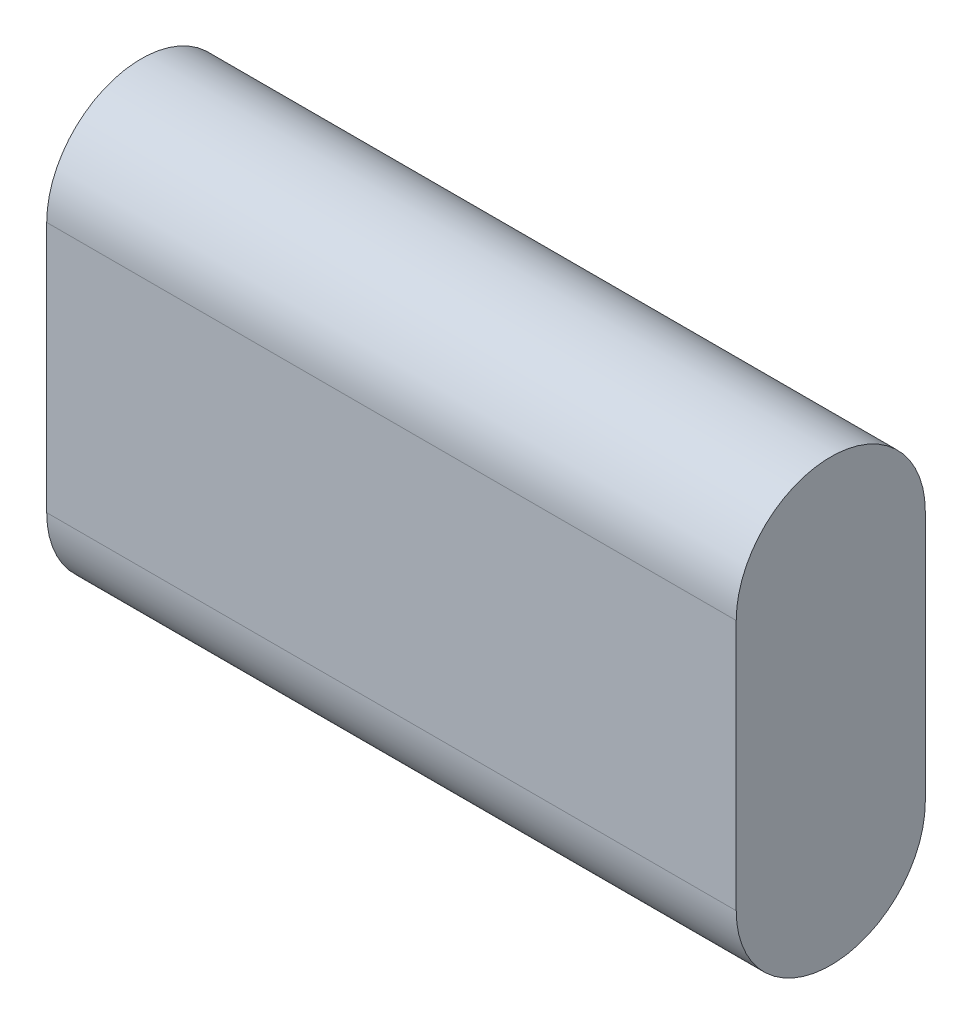
ISO-10303-21;
HEADER;
FILE_DESCRIPTION(('STEP AP214'),'2;1');
FILE_NAME('part.step','',(''),(''),'','','');
FILE_SCHEMA(('AUTOMOTIVE_DESIGN { 1 0 10303 214 1 1 1 1 }'));
ENDSEC;
DATA;
#1=APPLICATION_CONTEXT('core data for automotive mechanical design processes');
#2=APPLICATION_PROTOCOL_DEFINITION('international standard','automotive_design',2000,#1);
#3=PRODUCT_CONTEXT('',#1,'mechanical');
#4=PRODUCT('Part','Part','',(#3));
#5=PRODUCT_RELATED_PRODUCT_CATEGORY('part','',(#4));
#6=PRODUCT_DEFINITION_FORMATION('','',#4);
#7=PRODUCT_DEFINITION_CONTEXT('part definition',#1,'design');
#8=PRODUCT_DEFINITION('design','',#6,#7);
#9=PRODUCT_DEFINITION_SHAPE('','',#8);
#10=(LENGTH_UNIT() NAMED_UNIT(*) SI_UNIT(.MILLI.,.METRE.));
#11=(NAMED_UNIT(*) PLANE_ANGLE_UNIT() SI_UNIT($,.RADIAN.));
#12=(NAMED_UNIT(*) SI_UNIT($,.STERADIAN.) SOLID_ANGLE_UNIT());
#13=UNCERTAINTY_MEASURE_WITH_UNIT(LENGTH_MEASURE(1.E-05),#10,'distance_accuracy_value','');
#14=(GEOMETRIC_REPRESENTATION_CONTEXT(3) GLOBAL_UNCERTAINTY_ASSIGNED_CONTEXT((#13)) GLOBAL_UNIT_ASSIGNED_CONTEXT((#10,
#11,#12)) REPRESENTATION_CONTEXT('',''));
#15=CARTESIAN_POINT('',(0.,0.,0.));
#16=DIRECTION('',(0.,0.,1.));
#17=DIRECTION('',(1.,0.,0.));
#18=AXIS2_PLACEMENT_3D('',#15,#16,#17);
#19=CARTESIAN_POINT('',(15.5,-5.65,0.));
#20=DIRECTION('',(-1.,0.,0.));
#21=DIRECTION('',(0.,0.,1.));
#22=AXIS2_PLACEMENT_3D('',#19,#20,#21);
#23=CYLINDRICAL_SURFACE('',#22,4.25);
#24=CARTESIAN_POINT('',(-15.5,-5.65,0.));
#25=DIRECTION('',(1.,0.,0.));
#26=DIRECTION('',(0.,0.,-1.));
#27=AXIS2_PLACEMENT_3D('',#24,#25,#26);
#28=CIRCLE('',#27,4.25);
#29=CARTESIAN_POINT('',(-15.5,-5.65,4.25));
#30=VERTEX_POINT('',#29);
#31=CARTESIAN_POINT('',(-15.5,-5.65,-4.25));
#32=VERTEX_POINT('',#31);
#33=EDGE_CURVE('E105',#30,#32,#28,.T.);
#34=ORIENTED_EDGE('',*,*,#33,.T.);
#35=DIRECTION('',(-1.,0.,0.));
#36=VECTOR('',#35,1.);
#37=CARTESIAN_POINT('',(15.5,-5.65,-4.25));
#38=LINE('',#37,#36);
#39=CARTESIAN_POINT('',(15.5,-5.65,-4.25));
#40=VERTEX_POINT('',#39);
#41=EDGE_CURVE('E11',#40,#32,#38,.T.);
#42=ORIENTED_EDGE('',*,*,#41,.F.);
#43=CARTESIAN_POINT('',(15.5,-5.65,0.));
#44=DIRECTION('',(1.,0.,0.));
#45=DIRECTION('',(0.,0.,-1.));
#46=AXIS2_PLACEMENT_3D('',#43,#44,#45);
#47=CIRCLE('',#46,4.25);
#48=CARTESIAN_POINT('',(15.5,-5.65,4.25));
#49=VERTEX_POINT('',#48);
#50=EDGE_CURVE('E89',#49,#40,#47,.T.);
#51=ORIENTED_EDGE('',*,*,#50,.F.);
#52=DIRECTION('',(-1.,0.,0.));
#53=VECTOR('',#52,1.);
#54=CARTESIAN_POINT('',(15.5,-5.65,4.25));
#55=LINE('',#54,#53);
#56=EDGE_CURVE('E97',#49,#30,#55,.T.);
#57=ORIENTED_EDGE('',*,*,#56,.T.);
#58=EDGE_LOOP('',(#34,#42,#51,#57));
#59=FACE_BOUND('',#58,.T.);
#60=ADVANCED_FACE('F39',(#59),#23,.T.);
#61=CARTESIAN_POINT('',(15.5,-5.65,-4.25));
#62=DIRECTION('',(0.,0.,1.));
#63=DIRECTION('',(0.,-1.,0.));
#64=AXIS2_PLACEMENT_3D('',#61,#62,#63);
#65=PLANE('',#64);
#66=DIRECTION('',(0.,1.,0.));
#67=VECTOR('',#66,1.);
#68=CARTESIAN_POINT('',(-15.5,-5.65,-4.25));
#69=LINE('',#68,#67);
#70=CARTESIAN_POINT('',(-15.5,5.65,-4.25));
#71=VERTEX_POINT('',#70);
#72=EDGE_CURVE('E92',#32,#71,#69,.T.);
#73=ORIENTED_EDGE('',*,*,#72,.T.);
#74=DIRECTION('',(-1.,0.,0.));
#75=VECTOR('',#74,1.);
#76=CARTESIAN_POINT('',(15.5,5.65,-4.25));
#77=LINE('',#76,#75);
#78=CARTESIAN_POINT('',(15.5,5.65,-4.25));
#79=VERTEX_POINT('',#78);
#80=EDGE_CURVE('E50',#79,#71,#77,.T.);
#81=ORIENTED_EDGE('',*,*,#80,.F.);
#82=DIRECTION('',(0.,1.,0.));
#83=VECTOR('',#82,1.);
#84=CARTESIAN_POINT('',(15.5,-5.65,-4.25));
#85=LINE('',#84,#83);
#86=EDGE_CURVE('E82',#40,#79,#85,.T.);
#87=ORIENTED_EDGE('',*,*,#86,.F.);
#88=ORIENTED_EDGE('',*,*,#41,.T.);
#89=EDGE_LOOP('',(#73,#81,#87,#88));
#90=FACE_BOUND('',#89,.T.);
#91=ADVANCED_FACE('F93',(#90),#65,.F.);
#92=CARTESIAN_POINT('',(15.5,5.65,0.));
#93=DIRECTION('',(-1.,0.,0.));
#94=DIRECTION('',(0.,0.,1.));
#95=AXIS2_PLACEMENT_3D('',#92,#93,#94);
#96=CYLINDRICAL_SURFACE('',#95,4.25);
#97=CARTESIAN_POINT('',(-15.5,5.65,0.));
#98=DIRECTION('',(1.,0.,0.));
#99=DIRECTION('',(0.,0.,-1.));
#100=AXIS2_PLACEMENT_3D('',#97,#98,#99);
#101=CIRCLE('',#100,4.25);
#102=CARTESIAN_POINT('',(-15.5,5.65,4.25));
#103=VERTEX_POINT('',#102);
#104=EDGE_CURVE('E75',#71,#103,#101,.T.);
#105=ORIENTED_EDGE('',*,*,#104,.T.);
#106=DIRECTION('',(-1.,0.,0.));
#107=VECTOR('',#106,1.);
#108=CARTESIAN_POINT('',(15.5,5.65,4.25));
#109=LINE('',#108,#107);
#110=CARTESIAN_POINT('',(15.5,5.65,4.25));
#111=VERTEX_POINT('',#110);
#112=EDGE_CURVE('E94',#111,#103,#109,.T.);
#113=ORIENTED_EDGE('',*,*,#112,.F.);
#114=CARTESIAN_POINT('',(15.5,5.65,0.));
#115=DIRECTION('',(1.,0.,0.));
#116=DIRECTION('',(0.,0.,-1.));
#117=AXIS2_PLACEMENT_3D('',#114,#115,#116);
#118=CIRCLE('',#117,4.25);
#119=EDGE_CURVE('E88',#79,#111,#118,.T.);
#120=ORIENTED_EDGE('',*,*,#119,.F.);
#121=ORIENTED_EDGE('',*,*,#80,.T.);
#122=EDGE_LOOP('',(#105,#113,#120,#121));
#123=FACE_BOUND('',#122,.T.);
#124=ADVANCED_FACE('F96',(#123),#96,.T.);
#125=CARTESIAN_POINT('',(15.5,-5.65,4.25));
#126=DIRECTION('',(0.,0.,-1.));
#127=DIRECTION('',(0.,1.,0.));
#128=AXIS2_PLACEMENT_3D('',#125,#126,#127);
#129=PLANE('',#128);
#130=DIRECTION('',(0.,-1.,0.));
#131=VECTOR('',#130,1.);
#132=CARTESIAN_POINT('',(-15.5,-5.65,4.25));
#133=LINE('',#132,#131);
#134=EDGE_CURVE('E76',#103,#30,#133,.T.);
#135=ORIENTED_EDGE('',*,*,#134,.T.);
#136=ORIENTED_EDGE('',*,*,#56,.F.);
#137=DIRECTION('',(0.,-1.,0.));
#138=VECTOR('',#137,1.);
#139=CARTESIAN_POINT('',(15.5,-5.65,4.25));
#140=LINE('',#139,#138);
#141=EDGE_CURVE('E54',#111,#49,#140,.T.);
#142=ORIENTED_EDGE('',*,*,#141,.F.);
#143=ORIENTED_EDGE('',*,*,#112,.T.);
#144=EDGE_LOOP('',(#135,#136,#142,#143));
#145=FACE_BOUND('',#144,.T.);
#146=ADVANCED_FACE('F107',(#145),#129,.F.);
#147=CARTESIAN_POINT('',(15.5,-5.65,0.));
#148=DIRECTION('',(1.,0.,0.));
#149=DIRECTION('',(0.,0.,-1.));
#150=AXIS2_PLACEMENT_3D('',#147,#148,#149);
#151=PLANE('',#150);
#152=ORIENTED_EDGE('',*,*,#50,.T.);
#153=ORIENTED_EDGE('',*,*,#86,.T.);
#154=ORIENTED_EDGE('',*,*,#119,.T.);
#155=ORIENTED_EDGE('',*,*,#141,.T.);
#156=EDGE_LOOP('',(#152,#153,#154,#155));
#157=FACE_BOUND('',#156,.T.);
#158=ADVANCED_FACE('F86',(#157),#151,.T.);
#159=CARTESIAN_POINT('',(-15.5,-5.65,0.));
#160=DIRECTION('',(1.,0.,0.));
#161=DIRECTION('',(0.,0.,-1.));
#162=AXIS2_PLACEMENT_3D('',#159,#160,#161);
#163=PLANE('',#162);
#164=ORIENTED_EDGE('',*,*,#33,.F.);
#165=ORIENTED_EDGE('',*,*,#134,.F.);
#166=ORIENTED_EDGE('',*,*,#104,.F.);
#167=ORIENTED_EDGE('',*,*,#72,.F.);
#168=EDGE_LOOP('',(#164,#165,#166,#167));
#169=FACE_BOUND('',#168,.T.);
#170=ADVANCED_FACE('F115',(#169),#163,.F.);
#171=CLOSED_SHELL('',(#60,#91,#124,#146,#158,#170));
#172=MANIFOLD_SOLID_BREP('B2',#171);
#173=ADVANCED_BREP_SHAPE_REPRESENTATION('',(#18,#172),#14);
#174=SHAPE_DEFINITION_REPRESENTATION(#9,#173);
ENDSEC;
END-ISO-10303-21;
